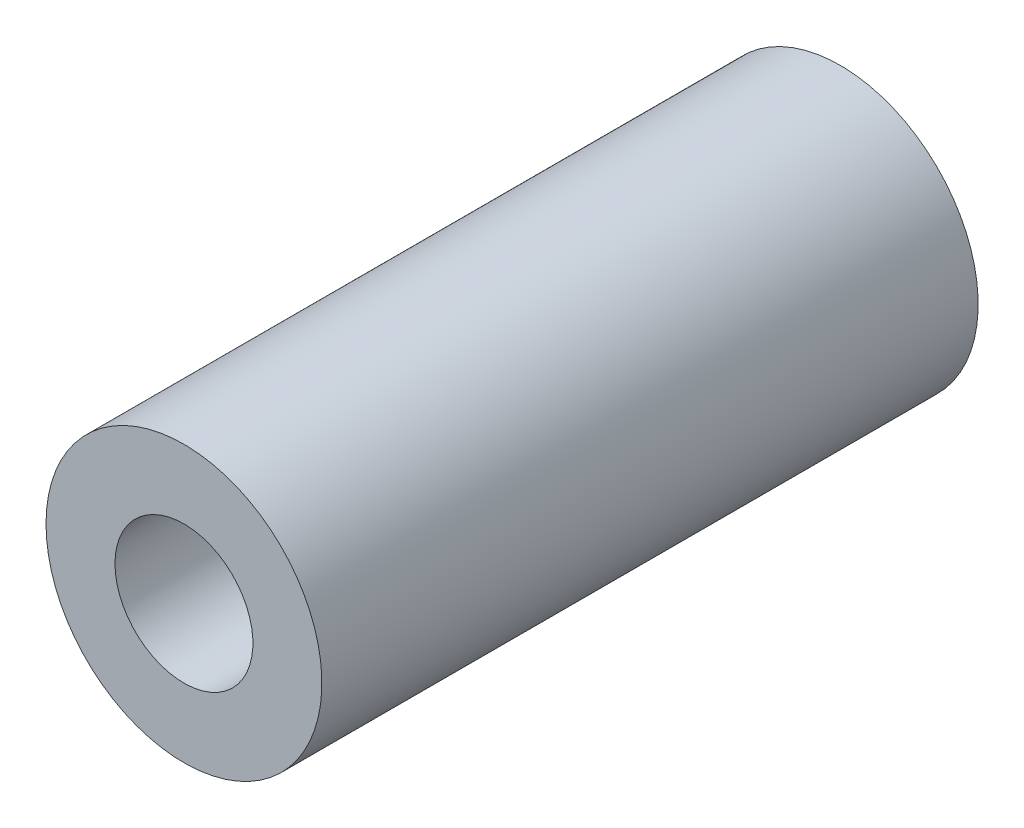
ISO-10303-21;
HEADER;
FILE_DESCRIPTION(('STEP AP214'),'2;1');
FILE_NAME('part.step','',(''),(''),'','','');
FILE_SCHEMA(('AUTOMOTIVE_DESIGN { 1 0 10303 214 1 1 1 1 }'));
ENDSEC;
DATA;
#1=APPLICATION_CONTEXT('core data for automotive mechanical design processes');
#2=APPLICATION_PROTOCOL_DEFINITION('international standard','automotive_design',2000,#1);
#3=PRODUCT_CONTEXT('',#1,'mechanical');
#4=PRODUCT('Part','Part','',(#3));
#5=PRODUCT_RELATED_PRODUCT_CATEGORY('part','',(#4));
#6=PRODUCT_DEFINITION_FORMATION('','',#4);
#7=PRODUCT_DEFINITION_CONTEXT('part definition',#1,'design');
#8=PRODUCT_DEFINITION('design','',#6,#7);
#9=PRODUCT_DEFINITION_SHAPE('','',#8);
#10=(LENGTH_UNIT() NAMED_UNIT(*) SI_UNIT(.MILLI.,.METRE.));
#11=(NAMED_UNIT(*) PLANE_ANGLE_UNIT() SI_UNIT($,.RADIAN.));
#12=(NAMED_UNIT(*) SI_UNIT($,.STERADIAN.) SOLID_ANGLE_UNIT());
#13=UNCERTAINTY_MEASURE_WITH_UNIT(LENGTH_MEASURE(1.E-05),#10,'distance_accuracy_value','');
#14=(GEOMETRIC_REPRESENTATION_CONTEXT(3) GLOBAL_UNCERTAINTY_ASSIGNED_CONTEXT((#13)) GLOBAL_UNIT_ASSIGNED_CONTEXT((#10,
#11,#12)) REPRESENTATION_CONTEXT('',''));
#15=CARTESIAN_POINT('',(0.,0.,0.));
#16=DIRECTION('',(0.,0.,1.));
#17=DIRECTION('',(1.,0.,0.));
#18=AXIS2_PLACEMENT_3D('',#15,#16,#17);
#19=CARTESIAN_POINT('',(0.,0.,15.10665));
#20=DIRECTION('',(0.,0.,1.));
#21=DIRECTION('',(1.,0.,0.));
#22=AXIS2_PLACEMENT_3D('',#19,#20,#21);
#23=PLANE('',#22);
#24=CARTESIAN_POINT('',(0.,0.,15.10665));
#25=DIRECTION('',(0.,0.,1.));
#26=DIRECTION('',(1.,0.,0.));
#27=AXIS2_PLACEMENT_3D('',#24,#25,#26);
#28=CIRCLE('',#27,6.35);
#29=CARTESIAN_POINT('',(-6.35,0.,15.10665));
#30=VERTEX_POINT('',#29);
#31=EDGE_CURVE('E10',#30,#30,#28,.T.);
#32=ORIENTED_EDGE('',*,*,#31,.T.);
#33=EDGE_LOOP('',(#32));
#34=FACE_BOUND('',#33,.T.);
#35=CARTESIAN_POINT('',(0.,0.,15.10665));
#36=DIRECTION('',(0.,0.,1.));
#37=DIRECTION('',(1.,0.,0.));
#38=AXIS2_PLACEMENT_3D('',#35,#36,#37);
#39=CIRCLE('',#38,3.175);
#40=CARTESIAN_POINT('',(-3.175,0.,15.10665));
#41=VERTEX_POINT('',#40);
#42=EDGE_CURVE('E42',#41,#41,#39,.T.);
#43=ORIENTED_EDGE('',*,*,#42,.F.);
#44=EDGE_LOOP('',(#43));
#45=FACE_BOUND('',#44,.T.);
#46=ADVANCED_FACE('F31',(#34,#45),#23,.T.);
#47=CARTESIAN_POINT('',(0.,0.,-15.10665));
#48=DIRECTION('',(0.,0.,1.));
#49=DIRECTION('',(1.,0.,0.));
#50=AXIS2_PLACEMENT_3D('',#47,#48,#49);
#51=PLANE('',#50);
#52=CARTESIAN_POINT('',(0.,0.,-15.10665));
#53=DIRECTION('',(0.,0.,1.));
#54=DIRECTION('',(1.,0.,0.));
#55=AXIS2_PLACEMENT_3D('',#52,#53,#54);
#56=CIRCLE('',#55,6.35);
#57=CARTESIAN_POINT('',(-6.35,0.,-15.10665));
#58=VERTEX_POINT('',#57);
#59=EDGE_CURVE('E35',#58,#58,#56,.T.);
#60=ORIENTED_EDGE('',*,*,#59,.F.);
#61=EDGE_LOOP('',(#60));
#62=FACE_BOUND('',#61,.T.);
#63=CARTESIAN_POINT('',(0.,0.,-15.10665));
#64=DIRECTION('',(0.,0.,1.));
#65=DIRECTION('',(1.,0.,0.));
#66=AXIS2_PLACEMENT_3D('',#63,#64,#65);
#67=CIRCLE('',#66,3.175);
#68=CARTESIAN_POINT('',(-3.175,0.,-15.10665));
#69=VERTEX_POINT('',#68);
#70=EDGE_CURVE('E44',#69,#69,#67,.T.);
#71=ORIENTED_EDGE('',*,*,#70,.T.);
#72=EDGE_LOOP('',(#71));
#73=FACE_BOUND('',#72,.T.);
#74=ADVANCED_FACE('F54',(#62,#73),#51,.F.);
#75=CARTESIAN_POINT('',(0.,0.,15.10665));
#76=DIRECTION('',(0.,0.,-1.));
#77=DIRECTION('',(-1.,0.,0.));
#78=AXIS2_PLACEMENT_3D('',#75,#76,#77);
#79=CYLINDRICAL_SURFACE('',#78,6.35);
#80=CARTESIAN_POINT('',(-6.35,0.,15.10665));
#81=CARTESIAN_POINT('',(-6.35,0.,14.791928125));
#82=CARTESIAN_POINT('',(-6.35,0.,14.47720625));
#83=CARTESIAN_POINT('',(-6.35,0.,13.8477625));
#84=CARTESIAN_POINT('',(-6.35,0.,13.533040625));
#85=CARTESIAN_POINT('',(-6.35,0.,12.903596875));
#86=CARTESIAN_POINT('',(-6.35,0.,12.588875));
#87=CARTESIAN_POINT('',(-6.35,0.,11.95943125));
#88=CARTESIAN_POINT('',(-6.35,0.,11.644709375));
#89=CARTESIAN_POINT('',(-6.35,0.,11.015265625));
#90=CARTESIAN_POINT('',(-6.35,0.,10.70054375));
#91=CARTESIAN_POINT('',(-6.35,0.,10.0711));
#92=CARTESIAN_POINT('',(-6.35,0.,9.756378125));
#93=CARTESIAN_POINT('',(-6.35,0.,9.126934375));
#94=CARTESIAN_POINT('',(-6.35,0.,8.8122125));
#95=CARTESIAN_POINT('',(-6.35,0.,8.18276875));
#96=CARTESIAN_POINT('',(-6.35,0.,7.868046875));
#97=CARTESIAN_POINT('',(-6.35,0.,7.238603125));
#98=CARTESIAN_POINT('',(-6.35,0.,6.92388125));
#99=CARTESIAN_POINT('',(-6.35,0.,6.2944375));
#100=CARTESIAN_POINT('',(-6.35,0.,5.979715625));
#101=CARTESIAN_POINT('',(-6.35,0.,5.350271875));
#102=CARTESIAN_POINT('',(-6.35,0.,5.03555));
#103=CARTESIAN_POINT('',(-6.35,0.,4.40610625));
#104=CARTESIAN_POINT('',(-6.35,0.,4.091384375));
#105=CARTESIAN_POINT('',(-6.35,0.,3.461940625));
#106=CARTESIAN_POINT('',(-6.35,0.,3.14721875));
#107=CARTESIAN_POINT('',(-6.35,0.,2.517775));
#108=CARTESIAN_POINT('',(-6.35,0.,2.203053125));
#109=CARTESIAN_POINT('',(-6.35,0.,1.573609375));
#110=CARTESIAN_POINT('',(-6.35,0.,1.2588875));
#111=CARTESIAN_POINT('',(-6.35,0.,0.629443749999997));
#112=CARTESIAN_POINT('',(-6.35,0.,0.314721874999996));
#113=CARTESIAN_POINT('',(-6.35,0.,-0.314721875000002));
#114=CARTESIAN_POINT('',(-6.35,0.,-0.629443750000001));
#115=CARTESIAN_POINT('',(-6.35,0.,-1.2588875));
#116=CARTESIAN_POINT('',(-6.35,0.,-1.573609375));
#117=CARTESIAN_POINT('',(-6.35,0.,-2.203053125));
#118=CARTESIAN_POINT('',(-6.35,0.,-2.517775));
#119=CARTESIAN_POINT('',(-6.35,0.,-3.14721875));
#120=CARTESIAN_POINT('',(-6.35,0.,-3.461940625));
#121=CARTESIAN_POINT('',(-6.35,0.,-4.091384375));
#122=CARTESIAN_POINT('',(-6.35,0.,-4.40610625));
#123=CARTESIAN_POINT('',(-6.35,0.,-5.03555));
#124=CARTESIAN_POINT('',(-6.35,0.,-5.350271875));
#125=CARTESIAN_POINT('',(-6.35,0.,-5.979715625));
#126=CARTESIAN_POINT('',(-6.35,0.,-6.2944375));
#127=CARTESIAN_POINT('',(-6.35,0.,-6.92388125));
#128=CARTESIAN_POINT('',(-6.35,0.,-7.238603125));
#129=CARTESIAN_POINT('',(-6.35,0.,-7.868046875));
#130=CARTESIAN_POINT('',(-6.35,0.,-8.18276875));
#131=CARTESIAN_POINT('',(-6.35,0.,-8.8122125));
#132=CARTESIAN_POINT('',(-6.35,0.,-9.126934375));
#133=CARTESIAN_POINT('',(-6.35,0.,-9.756378125));
#134=CARTESIAN_POINT('',(-6.35,0.,-10.0711));
#135=CARTESIAN_POINT('',(-6.35,0.,-10.70054375));
#136=CARTESIAN_POINT('',(-6.35,0.,-11.015265625));
#137=CARTESIAN_POINT('',(-6.35,0.,-11.644709375));
#138=CARTESIAN_POINT('',(-6.35,0.,-11.95943125));
#139=CARTESIAN_POINT('',(-6.35,0.,-12.588875));
#140=CARTESIAN_POINT('',(-6.35,0.,-12.903596875));
#141=CARTESIAN_POINT('',(-6.35,0.,-13.533040625));
#142=CARTESIAN_POINT('',(-6.35,0.,-13.8477625));
#143=CARTESIAN_POINT('',(-6.35,0.,-14.47720625));
#144=CARTESIAN_POINT('',(-6.35,0.,-14.791928125));
#145=CARTESIAN_POINT('',(-6.35,0.,-15.10665));
#146=B_SPLINE_CURVE_WITH_KNOTS('',3,(#80,#81,#82,#83,#84,#85,#86,#87,#88,#89,#90,#91,#92,#93,
#94,#95,#96,#97,#98,#99,#100,#101,#102,#103,#104,#105,#106,#107,#108,#109,#110,#111,#112,#113,
#114,#115,#116,#117,#118,#119,#120,#121,#122,#123,#124,#125,#126,#127,#128,#129,#130,#131,#132,
#133,#134,#135,#136,#137,#138,#139,#140,#141,#142,#143,#144,#145),.UNSPECIFIED.,.F.,.F.,(4,2,2,
2,2,2,2,2,2,2,2,2,2,2,2,2,2,2,2,2,2,2,2,2,2,2,2,2,2,2,2,2,4),(0.,0.944165625,1.88833125,
2.832496875,3.7766625,4.720828125,5.66499375,6.609159375,7.553325,8.497490625,9.44165625,
10.385821875,11.3299875,12.274153125,13.21831875,14.162484375,15.10665,16.050815625,16.99498125,
17.939146875,18.8833125,19.827478125,20.77164375,21.715809375,22.659975,23.604140625,
24.54830625,25.492471875,26.4366375,27.380803125,28.32496875,29.269134375,30.2133),.UNSPECIFIED.);
#147=EDGE_CURVE('BSEAM33',#30,#58,#146,.T.);
#148=ORIENTED_EDGE('',*,*,#31,.F.);
#149=ORIENTED_EDGE('',*,*,#59,.T.);
#150=ORIENTED_EDGE('',*,*,#147,.T.);
#151=ORIENTED_EDGE('',*,*,#147,.F.);
#152=EDGE_LOOP('',(#148,#150,#149,#151));
#153=FACE_BOUND('',#152,.T.);
#154=ADVANCED_FACE('F33',(#153),#79,.T.);
#155=CARTESIAN_POINT('',(0.,0.,15.10665));
#156=DIRECTION('',(0.,0.,-1.));
#157=DIRECTION('',(-1.,0.,0.));
#158=AXIS2_PLACEMENT_3D('',#155,#156,#157);
#159=CYLINDRICAL_SURFACE('',#158,3.175);
#160=CARTESIAN_POINT('',(-3.175,0.,15.10665));
#161=CARTESIAN_POINT('',(-3.175,0.,14.791928125));
#162=CARTESIAN_POINT('',(-3.175,0.,14.47720625));
#163=CARTESIAN_POINT('',(-3.175,0.,13.8477625));
#164=CARTESIAN_POINT('',(-3.175,0.,13.533040625));
#165=CARTESIAN_POINT('',(-3.175,0.,12.903596875));
#166=CARTESIAN_POINT('',(-3.175,0.,12.588875));
#167=CARTESIAN_POINT('',(-3.175,0.,11.95943125));
#168=CARTESIAN_POINT('',(-3.175,0.,11.644709375));
#169=CARTESIAN_POINT('',(-3.175,0.,11.015265625));
#170=CARTESIAN_POINT('',(-3.175,0.,10.70054375));
#171=CARTESIAN_POINT('',(-3.175,0.,10.0711));
#172=CARTESIAN_POINT('',(-3.175,0.,9.756378125));
#173=CARTESIAN_POINT('',(-3.175,0.,9.126934375));
#174=CARTESIAN_POINT('',(-3.175,0.,8.8122125));
#175=CARTESIAN_POINT('',(-3.175,0.,8.18276875));
#176=CARTESIAN_POINT('',(-3.175,0.,7.868046875));
#177=CARTESIAN_POINT('',(-3.175,0.,7.238603125));
#178=CARTESIAN_POINT('',(-3.175,0.,6.92388125));
#179=CARTESIAN_POINT('',(-3.175,0.,6.2944375));
#180=CARTESIAN_POINT('',(-3.175,0.,5.979715625));
#181=CARTESIAN_POINT('',(-3.175,0.,5.350271875));
#182=CARTESIAN_POINT('',(-3.175,0.,5.03555));
#183=CARTESIAN_POINT('',(-3.175,0.,4.40610625));
#184=CARTESIAN_POINT('',(-3.175,0.,4.091384375));
#185=CARTESIAN_POINT('',(-3.175,0.,3.461940625));
#186=CARTESIAN_POINT('',(-3.175,0.,3.14721875));
#187=CARTESIAN_POINT('',(-3.175,0.,2.517775));
#188=CARTESIAN_POINT('',(-3.175,0.,2.203053125));
#189=CARTESIAN_POINT('',(-3.175,0.,1.573609375));
#190=CARTESIAN_POINT('',(-3.175,0.,1.2588875));
#191=CARTESIAN_POINT('',(-3.175,0.,0.629443749999997));
#192=CARTESIAN_POINT('',(-3.175,0.,0.314721874999996));
#193=CARTESIAN_POINT('',(-3.175,0.,-0.314721875000002));
#194=CARTESIAN_POINT('',(-3.175,0.,-0.629443750000001));
#195=CARTESIAN_POINT('',(-3.175,0.,-1.2588875));
#196=CARTESIAN_POINT('',(-3.175,0.,-1.573609375));
#197=CARTESIAN_POINT('',(-3.175,0.,-2.203053125));
#198=CARTESIAN_POINT('',(-3.175,0.,-2.517775));
#199=CARTESIAN_POINT('',(-3.175,0.,-3.14721875));
#200=CARTESIAN_POINT('',(-3.175,0.,-3.461940625));
#201=CARTESIAN_POINT('',(-3.175,0.,-4.091384375));
#202=CARTESIAN_POINT('',(-3.175,0.,-4.40610625));
#203=CARTESIAN_POINT('',(-3.175,0.,-5.03555));
#204=CARTESIAN_POINT('',(-3.175,0.,-5.350271875));
#205=CARTESIAN_POINT('',(-3.175,0.,-5.979715625));
#206=CARTESIAN_POINT('',(-3.175,0.,-6.2944375));
#207=CARTESIAN_POINT('',(-3.175,0.,-6.92388125));
#208=CARTESIAN_POINT('',(-3.175,0.,-7.238603125));
#209=CARTESIAN_POINT('',(-3.175,0.,-7.868046875));
#210=CARTESIAN_POINT('',(-3.175,0.,-8.18276875));
#211=CARTESIAN_POINT('',(-3.175,0.,-8.8122125));
#212=CARTESIAN_POINT('',(-3.175,0.,-9.126934375));
#213=CARTESIAN_POINT('',(-3.175,0.,-9.756378125));
#214=CARTESIAN_POINT('',(-3.175,0.,-10.0711));
#215=CARTESIAN_POINT('',(-3.175,0.,-10.70054375));
#216=CARTESIAN_POINT('',(-3.175,0.,-11.015265625));
#217=CARTESIAN_POINT('',(-3.175,0.,-11.644709375));
#218=CARTESIAN_POINT('',(-3.175,0.,-11.95943125));
#219=CARTESIAN_POINT('',(-3.175,0.,-12.588875));
#220=CARTESIAN_POINT('',(-3.175,0.,-12.903596875));
#221=CARTESIAN_POINT('',(-3.175,0.,-13.533040625));
#222=CARTESIAN_POINT('',(-3.175,0.,-13.8477625));
#223=CARTESIAN_POINT('',(-3.175,0.,-14.47720625));
#224=CARTESIAN_POINT('',(-3.175,0.,-14.791928125));
#225=CARTESIAN_POINT('',(-3.175,0.,-15.10665));
#226=B_SPLINE_CURVE_WITH_KNOTS('',3,(#160,#161,#162,#163,#164,#165,#166,#167,#168,#169,#170,
#171,#172,#173,#174,#175,#176,#177,#178,#179,#180,#181,#182,#183,#184,#185,#186,#187,#188,#189,
#190,#191,#192,#193,#194,#195,#196,#197,#198,#199,#200,#201,#202,#203,#204,#205,#206,#207,#208,
#209,#210,#211,#212,#213,#214,#215,#216,#217,#218,#219,#220,#221,#222,#223,#224,#225),
.UNSPECIFIED.,.F.,.F.,(4,2,2,2,2,2,2,2,2,2,2,2,2,2,2,2,2,2,2,2,2,2,2,2,2,2,2,2,2,2,2,2,4),(0.,
0.944165625,1.88833125,2.832496875,3.7766625,4.720828125,5.66499375,6.609159375,7.553325,
8.497490625,9.44165625,10.385821875,11.3299875,12.274153125,13.21831875,14.162484375,15.10665,
16.050815625,16.99498125,17.939146875,18.8833125,19.827478125,20.77164375,21.715809375,
22.659975,23.604140625,24.54830625,25.492471875,26.4366375,27.380803125,28.32496875,
29.269134375,30.2133),.UNSPECIFIED.);
#227=EDGE_CURVE('BSEAM50',#41,#69,#226,.T.);
#228=ORIENTED_EDGE('',*,*,#42,.T.);
#229=ORIENTED_EDGE('',*,*,#70,.F.);
#230=ORIENTED_EDGE('',*,*,#227,.T.);
#231=ORIENTED_EDGE('',*,*,#227,.F.);
#232=EDGE_LOOP('',(#228,#230,#229,#231));
#233=FACE_BOUND('',#232,.T.);
#234=ADVANCED_FACE('F50',(#233),#159,.F.);
#235=CLOSED_SHELL('',(#46,#74,#154,#234));
#236=MANIFOLD_SOLID_BREP('B2',#235);
#237=ADVANCED_BREP_SHAPE_REPRESENTATION('',(#18,#236),#14);
#238=SHAPE_DEFINITION_REPRESENTATION(#9,#237);
ENDSEC;
END-ISO-10303-21;
